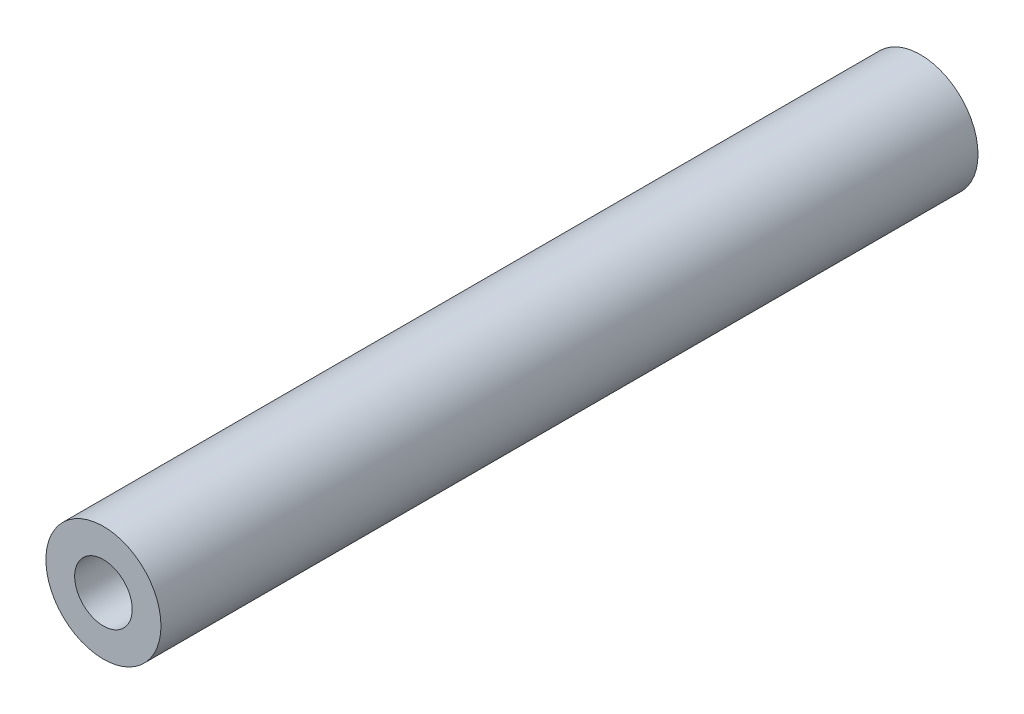
ISO-10303-21;
HEADER;
FILE_DESCRIPTION(('STEP AP214'),'2;1');
FILE_NAME('part.step','',(''),(''),'','','');
FILE_SCHEMA(('AUTOMOTIVE_DESIGN { 1 0 10303 214 1 1 1 1 }'));
ENDSEC;
DATA;
#1=APPLICATION_CONTEXT('core data for automotive mechanical design processes');
#2=APPLICATION_PROTOCOL_DEFINITION('international standard','automotive_design',2000,#1);
#3=PRODUCT_CONTEXT('',#1,'mechanical');
#4=PRODUCT('Part','Part','',(#3));
#5=PRODUCT_RELATED_PRODUCT_CATEGORY('part','',(#4));
#6=PRODUCT_DEFINITION_FORMATION('','',#4);
#7=PRODUCT_DEFINITION_CONTEXT('part definition',#1,'design');
#8=PRODUCT_DEFINITION('design','',#6,#7);
#9=PRODUCT_DEFINITION_SHAPE('','',#8);
#10=(LENGTH_UNIT() NAMED_UNIT(*) SI_UNIT(.MILLI.,.METRE.));
#11=(NAMED_UNIT(*) PLANE_ANGLE_UNIT() SI_UNIT($,.RADIAN.));
#12=(NAMED_UNIT(*) SI_UNIT($,.STERADIAN.) SOLID_ANGLE_UNIT());
#13=UNCERTAINTY_MEASURE_WITH_UNIT(LENGTH_MEASURE(1.E-05),#10,'distance_accuracy_value','');
#14=(GEOMETRIC_REPRESENTATION_CONTEXT(3) GLOBAL_UNCERTAINTY_ASSIGNED_CONTEXT((#13)) GLOBAL_UNIT_ASSIGNED_CONTEXT((#10,
#11,#12)) REPRESENTATION_CONTEXT('',''));
#15=CARTESIAN_POINT('',(0.,0.,0.));
#16=DIRECTION('',(0.,0.,1.));
#17=DIRECTION('',(1.,0.,0.));
#18=AXIS2_PLACEMENT_3D('',#15,#16,#17);
#19=CARTESIAN_POINT('',(0.,0.,71.));
#20=DIRECTION('',(0.,0.,1.));
#21=DIRECTION('',(1.,0.,0.));
#22=AXIS2_PLACEMENT_3D('',#19,#20,#21);
#23=PLANE('',#22);
#24=CARTESIAN_POINT('',(0.,0.,71.));
#25=DIRECTION('',(0.,0.,1.));
#26=DIRECTION('',(1.,0.,0.));
#27=AXIS2_PLACEMENT_3D('',#24,#25,#26);
#28=CIRCLE('',#27,5.);
#29=CARTESIAN_POINT('',(5.,0.,71.));
#30=VERTEX_POINT('',#29);
#31=EDGE_CURVE('E10',#30,#30,#28,.T.);
#32=ORIENTED_EDGE('',*,*,#31,.T.);
#33=EDGE_LOOP('',(#32));
#34=FACE_BOUND('',#33,.T.);
#35=CARTESIAN_POINT('',(0.,0.,71.));
#36=DIRECTION('',(0.,0.,1.));
#37=DIRECTION('',(1.,0.,0.));
#38=AXIS2_PLACEMENT_3D('',#35,#36,#37);
#39=CIRCLE('',#38,2.5);
#40=CARTESIAN_POINT('',(2.5,0.,71.));
#41=VERTEX_POINT('',#40);
#42=EDGE_CURVE('E43',#41,#41,#39,.T.);
#43=ORIENTED_EDGE('',*,*,#42,.F.);
#44=EDGE_LOOP('',(#43));
#45=FACE_BOUND('',#44,.T.);
#46=ADVANCED_FACE('F32',(#34,#45),#23,.T.);
#47=CARTESIAN_POINT('',(0.,0.,0.));
#48=DIRECTION('',(0.,0.,1.));
#49=DIRECTION('',(1.,0.,0.));
#50=AXIS2_PLACEMENT_3D('',#47,#48,#49);
#51=PLANE('',#50);
#52=CARTESIAN_POINT('',(0.,0.,0.));
#53=DIRECTION('',(0.,0.,1.));
#54=DIRECTION('',(1.,0.,0.));
#55=AXIS2_PLACEMENT_3D('',#52,#53,#54);
#56=CIRCLE('',#55,5.);
#57=CARTESIAN_POINT('',(5.,0.,0.));
#58=VERTEX_POINT('',#57);
#59=EDGE_CURVE('E36',#58,#58,#56,.T.);
#60=ORIENTED_EDGE('',*,*,#59,.F.);
#61=EDGE_LOOP('',(#60));
#62=FACE_BOUND('',#61,.T.);
#63=CARTESIAN_POINT('',(0.,0.,0.));
#64=DIRECTION('',(0.,0.,1.));
#65=DIRECTION('',(1.,0.,0.));
#66=AXIS2_PLACEMENT_3D('',#63,#64,#65);
#67=CIRCLE('',#66,2.5);
#68=CARTESIAN_POINT('',(2.5,0.,0.));
#69=VERTEX_POINT('',#68);
#70=EDGE_CURVE('E45',#69,#69,#67,.T.);
#71=ORIENTED_EDGE('',*,*,#70,.T.);
#72=EDGE_LOOP('',(#71));
#73=FACE_BOUND('',#72,.T.);
#74=ADVANCED_FACE('F55',(#62,#73),#51,.F.);
#75=CARTESIAN_POINT('',(0.,0.,71.));
#76=DIRECTION('',(0.,0.,-1.));
#77=DIRECTION('',(-1.,0.,0.));
#78=AXIS2_PLACEMENT_3D('',#75,#76,#77);
#79=CYLINDRICAL_SURFACE('',#78,5.);
#80=ORIENTED_EDGE('',*,*,#31,.F.);
#81=EDGE_LOOP('',(#80));
#82=FACE_BOUND('',#81,.T.);
#83=ORIENTED_EDGE('',*,*,#59,.T.);
#84=EDGE_LOOP('',(#83));
#85=FACE_BOUND('',#84,.T.);
#86=ADVANCED_FACE('F34',(#82,#85),#79,.T.);
#87=CARTESIAN_POINT('',(0.,0.,71.));
#88=DIRECTION('',(0.,0.,-1.));
#89=DIRECTION('',(-1.,0.,0.));
#90=AXIS2_PLACEMENT_3D('',#87,#88,#89);
#91=CYLINDRICAL_SURFACE('',#90,2.5);
#92=ORIENTED_EDGE('',*,*,#42,.T.);
#93=EDGE_LOOP('',(#92));
#94=FACE_BOUND('',#93,.T.);
#95=ORIENTED_EDGE('',*,*,#70,.F.);
#96=EDGE_LOOP('',(#95));
#97=FACE_BOUND('',#96,.T.);
#98=ADVANCED_FACE('F51',(#94,#97),#91,.F.);
#99=CLOSED_SHELL('',(#46,#74,#86,#98));
#100=MANIFOLD_SOLID_BREP('B2',#99);
#101=ADVANCED_BREP_SHAPE_REPRESENTATION('',(#18,#100),#14);
#102=SHAPE_DEFINITION_REPRESENTATION(#9,#101);
ENDSEC;
END-ISO-10303-21;
